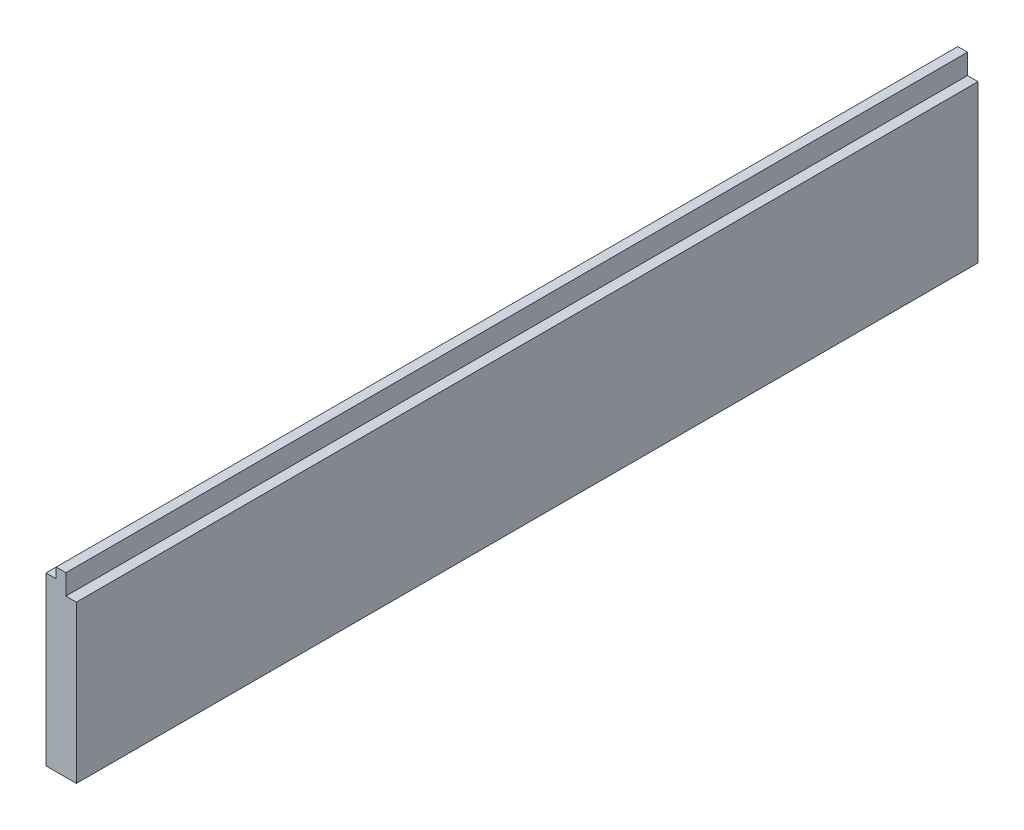
ISO-10303-21;
HEADER;
FILE_DESCRIPTION(('STEP AP214'),'2;1');
FILE_NAME('part.step','',(''),(''),'','','');
FILE_SCHEMA(('AUTOMOTIVE_DESIGN { 1 0 10303 214 1 1 1 1 }'));
ENDSEC;
DATA;
#1=APPLICATION_CONTEXT('core data for automotive mechanical design processes');
#2=APPLICATION_PROTOCOL_DEFINITION('international standard','automotive_design',2000,#1);
#3=PRODUCT_CONTEXT('',#1,'mechanical');
#4=PRODUCT('Part','Part','',(#3));
#5=PRODUCT_RELATED_PRODUCT_CATEGORY('part','',(#4));
#6=PRODUCT_DEFINITION_FORMATION('','',#4);
#7=PRODUCT_DEFINITION_CONTEXT('part definition',#1,'design');
#8=PRODUCT_DEFINITION('design','',#6,#7);
#9=PRODUCT_DEFINITION_SHAPE('','',#8);
#10=(LENGTH_UNIT() NAMED_UNIT(*) SI_UNIT(.MILLI.,.METRE.));
#11=(NAMED_UNIT(*) PLANE_ANGLE_UNIT() SI_UNIT($,.RADIAN.));
#12=(NAMED_UNIT(*) SI_UNIT($,.STERADIAN.) SOLID_ANGLE_UNIT());
#13=UNCERTAINTY_MEASURE_WITH_UNIT(LENGTH_MEASURE(1.E-05),#10,'distance_accuracy_value','');
#14=(GEOMETRIC_REPRESENTATION_CONTEXT(3) GLOBAL_UNCERTAINTY_ASSIGNED_CONTEXT((#13)) GLOBAL_UNIT_ASSIGNED_CONTEXT((#10,
#11,#12)) REPRESENTATION_CONTEXT('',''));
#15=CARTESIAN_POINT('',(0.,0.,0.));
#16=DIRECTION('',(0.,0.,1.));
#17=DIRECTION('',(1.,0.,0.));
#18=AXIS2_PLACEMENT_3D('',#15,#16,#17);
#19=CARTESIAN_POINT('',(0.,165.,890.));
#20=DIRECTION('',(1.,0.,0.));
#21=DIRECTION('',(0.,1.,0.));
#22=AXIS2_PLACEMENT_3D('',#19,#20,#21);
#23=PLANE('',#22);
#24=DIRECTION('',(0.,-1.,0.));
#25=VECTOR('',#24,1.);
#26=CARTESIAN_POINT('',(0.,165.,0.));
#27=LINE('',#26,#25);
#28=CARTESIAN_POINT('',(0.,165.,0.));
#29=VERTEX_POINT('',#28);
#30=CARTESIAN_POINT('',(0.,0.,0.));
#31=VERTEX_POINT('',#30);
#32=EDGE_CURVE('E131',#29,#31,#27,.T.);
#33=ORIENTED_EDGE('',*,*,#32,.T.);
#34=DIRECTION('',(0.,0.,-1.));
#35=VECTOR('',#34,1.);
#36=CARTESIAN_POINT('',(0.,0.,890.));
#37=LINE('',#36,#35);
#38=CARTESIAN_POINT('',(0.,0.,890.));
#39=VERTEX_POINT('',#38);
#40=EDGE_CURVE('E11',#39,#31,#37,.T.);
#41=ORIENTED_EDGE('',*,*,#40,.F.);
#42=DIRECTION('',(0.,-1.,0.));
#43=VECTOR('',#42,1.);
#44=CARTESIAN_POINT('',(0.,165.,890.));
#45=LINE('',#44,#43);
#46=CARTESIAN_POINT('',(0.,165.,890.));
#47=VERTEX_POINT('',#46);
#48=EDGE_CURVE('E145',#47,#39,#45,.T.);
#49=ORIENTED_EDGE('',*,*,#48,.F.);
#50=DIRECTION('',(0.,0.,-1.));
#51=VECTOR('',#50,1.);
#52=CARTESIAN_POINT('',(0.,165.,890.));
#53=LINE('',#52,#51);
#54=EDGE_CURVE('E127',#47,#29,#53,.T.);
#55=ORIENTED_EDGE('',*,*,#54,.T.);
#56=EDGE_LOOP('',(#33,#41,#49,#55));
#57=FACE_BOUND('',#56,.T.);
#58=ADVANCED_FACE('F35',(#57),#23,.F.);
#59=CARTESIAN_POINT('',(0.,0.,890.));
#60=DIRECTION('',(0.,1.,0.));
#61=DIRECTION('',(0.,0.,1.));
#62=AXIS2_PLACEMENT_3D('',#59,#60,#61);
#63=PLANE('',#62);
#64=DIRECTION('',(1.,0.,0.));
#65=VECTOR('',#64,1.);
#66=CARTESIAN_POINT('',(0.,0.,0.));
#67=LINE('',#66,#65);
#68=CARTESIAN_POINT('',(30.,0.,0.));
#69=VERTEX_POINT('',#68);
#70=EDGE_CURVE('E134',#31,#69,#67,.T.);
#71=ORIENTED_EDGE('',*,*,#70,.T.);
#72=DIRECTION('',(0.,0.,-1.));
#73=VECTOR('',#72,1.);
#74=CARTESIAN_POINT('',(30.,0.,890.));
#75=LINE('',#74,#73);
#76=CARTESIAN_POINT('',(30.,0.,890.));
#77=VERTEX_POINT('',#76);
#78=EDGE_CURVE('E43',#77,#69,#75,.T.);
#79=ORIENTED_EDGE('',*,*,#78,.F.);
#80=DIRECTION('',(1.,0.,0.));
#81=VECTOR('',#80,1.);
#82=CARTESIAN_POINT('',(0.,0.,890.));
#83=LINE('',#82,#81);
#84=EDGE_CURVE('E94',#39,#77,#83,.T.);
#85=ORIENTED_EDGE('',*,*,#84,.F.);
#86=ORIENTED_EDGE('',*,*,#40,.T.);
#87=EDGE_LOOP('',(#71,#79,#85,#86));
#88=FACE_BOUND('',#87,.T.);
#89=ADVANCED_FACE('F180',(#88),#63,.F.);
#90=CARTESIAN_POINT('',(30.,0.,890.));
#91=DIRECTION('',(-1.,0.,0.));
#92=DIRECTION('',(0.,-1.,0.));
#93=AXIS2_PLACEMENT_3D('',#90,#91,#92);
#94=PLANE('',#93);
#95=DIRECTION('',(0.,1.,0.));
#96=VECTOR('',#95,1.);
#97=CARTESIAN_POINT('',(30.,0.,0.));
#98=LINE('',#97,#96);
#99=CARTESIAN_POINT('',(30.,155.,0.));
#100=VERTEX_POINT('',#99);
#101=EDGE_CURVE('E136',#69,#100,#98,.T.);
#102=ORIENTED_EDGE('',*,*,#101,.T.);
#103=DIRECTION('',(0.,0.,-1.));
#104=VECTOR('',#103,1.);
#105=CARTESIAN_POINT('',(30.,155.,890.));
#106=LINE('',#105,#104);
#107=CARTESIAN_POINT('',(30.,155.,890.));
#108=VERTEX_POINT('',#107);
#109=EDGE_CURVE('E152',#108,#100,#106,.T.);
#110=ORIENTED_EDGE('',*,*,#109,.F.);
#111=DIRECTION('',(0.,1.,0.));
#112=VECTOR('',#111,1.);
#113=CARTESIAN_POINT('',(30.,0.,890.));
#114=LINE('',#113,#112);
#115=EDGE_CURVE('E160',#77,#108,#114,.T.);
#116=ORIENTED_EDGE('',*,*,#115,.F.);
#117=ORIENTED_EDGE('',*,*,#78,.T.);
#118=EDGE_LOOP('',(#102,#110,#116,#117));
#119=FACE_BOUND('',#118,.T.);
#120=ADVANCED_FACE('F158',(#119),#94,.F.);
#121=CARTESIAN_POINT('',(30.,155.,890.));
#122=DIRECTION('',(0.,-1.,0.));
#123=DIRECTION('',(0.,0.,-1.));
#124=AXIS2_PLACEMENT_3D('',#121,#122,#123);
#125=PLANE('',#124);
#126=DIRECTION('',(-1.,0.,0.));
#127=VECTOR('',#126,1.);
#128=CARTESIAN_POINT('',(30.,155.,0.));
#129=LINE('',#128,#127);
#130=CARTESIAN_POINT('',(19.6619478750926,155.,0.));
#131=VERTEX_POINT('',#130);
#132=EDGE_CURVE('E138',#100,#131,#129,.T.);
#133=ORIENTED_EDGE('',*,*,#132,.T.);
#134=DIRECTION('',(0.,0.,-1.));
#135=VECTOR('',#134,1.);
#136=CARTESIAN_POINT('',(19.6619478750926,155.,890.));
#137=LINE('',#136,#135);
#138=CARTESIAN_POINT('',(19.6619478750926,155.,890.));
#139=VERTEX_POINT('',#138);
#140=EDGE_CURVE('E149',#139,#131,#137,.T.);
#141=ORIENTED_EDGE('',*,*,#140,.F.);
#142=DIRECTION('',(-1.,0.,0.));
#143=VECTOR('',#142,1.);
#144=CARTESIAN_POINT('',(30.,155.,890.));
#145=LINE('',#144,#143);
#146=EDGE_CURVE('E172',#108,#139,#145,.T.);
#147=ORIENTED_EDGE('',*,*,#146,.F.);
#148=ORIENTED_EDGE('',*,*,#109,.T.);
#149=EDGE_LOOP('',(#133,#141,#147,#148));
#150=FACE_BOUND('',#149,.T.);
#151=ADVANCED_FACE('F168',(#150),#125,.F.);
#152=CARTESIAN_POINT('',(19.6619478750926,155.,890.));
#153=DIRECTION('',(-1.,0.,0.));
#154=DIRECTION('',(0.,-1.,0.));
#155=AXIS2_PLACEMENT_3D('',#152,#153,#154);
#156=PLANE('',#155);
#157=DIRECTION('',(0.,1.,0.));
#158=VECTOR('',#157,1.);
#159=CARTESIAN_POINT('',(19.6619478750926,155.,0.));
#160=LINE('',#159,#158);
#161=CARTESIAN_POINT('',(19.6619478750926,175.,0.));
#162=VERTEX_POINT('',#161);
#163=EDGE_CURVE('E140',#131,#162,#160,.T.);
#164=ORIENTED_EDGE('',*,*,#163,.T.);
#165=DIRECTION('',(0.,0.,-1.));
#166=VECTOR('',#165,1.);
#167=CARTESIAN_POINT('',(19.6619478750926,175.,890.));
#168=LINE('',#167,#166);
#169=CARTESIAN_POINT('',(19.6619478750926,175.,890.));
#170=VERTEX_POINT('',#169);
#171=EDGE_CURVE('E122',#170,#162,#168,.T.);
#172=ORIENTED_EDGE('',*,*,#171,.F.);
#173=DIRECTION('',(0.,1.,0.));
#174=VECTOR('',#173,1.);
#175=CARTESIAN_POINT('',(19.6619478750926,155.,890.));
#176=LINE('',#175,#174);
#177=EDGE_CURVE('E113',#139,#170,#176,.T.);
#178=ORIENTED_EDGE('',*,*,#177,.F.);
#179=ORIENTED_EDGE('',*,*,#140,.T.);
#180=EDGE_LOOP('',(#164,#172,#178,#179));
#181=FACE_BOUND('',#180,.T.);
#182=ADVANCED_FACE('F171',(#181),#156,.F.);
#183=CARTESIAN_POINT('',(19.6619478750926,175.,890.));
#184=DIRECTION('',(0.,-1.,0.));
#185=DIRECTION('',(0.,0.,-1.));
#186=AXIS2_PLACEMENT_3D('',#183,#184,#185);
#187=PLANE('',#186);
#188=DIRECTION('',(-1.,0.,0.));
#189=VECTOR('',#188,1.);
#190=CARTESIAN_POINT('',(19.6619478750926,175.,0.));
#191=LINE('',#190,#189);
#192=CARTESIAN_POINT('',(10.,175.,0.));
#193=VERTEX_POINT('',#192);
#194=EDGE_CURVE('E121',#162,#193,#191,.T.);
#195=ORIENTED_EDGE('',*,*,#194,.T.);
#196=DIRECTION('',(0.,0.,-1.));
#197=VECTOR('',#196,1.);
#198=CARTESIAN_POINT('',(10.,175.,890.));
#199=LINE('',#198,#197);
#200=CARTESIAN_POINT('',(10.,175.,890.));
#201=VERTEX_POINT('',#200);
#202=EDGE_CURVE('E118',#201,#193,#199,.T.);
#203=ORIENTED_EDGE('',*,*,#202,.F.);
#204=DIRECTION('',(-1.,0.,0.));
#205=VECTOR('',#204,1.);
#206=CARTESIAN_POINT('',(19.6619478750926,175.,890.));
#207=LINE('',#206,#205);
#208=EDGE_CURVE('E107',#170,#201,#207,.T.);
#209=ORIENTED_EDGE('',*,*,#208,.F.);
#210=ORIENTED_EDGE('',*,*,#171,.T.);
#211=EDGE_LOOP('',(#195,#203,#209,#210));
#212=FACE_BOUND('',#211,.T.);
#213=ADVANCED_FACE('F119',(#212),#187,.F.);
#214=CARTESIAN_POINT('',(10.,175.,890.));
#215=DIRECTION('',(1.,0.,0.));
#216=DIRECTION('',(0.,1.,0.));
#217=AXIS2_PLACEMENT_3D('',#214,#215,#216);
#218=PLANE('',#217);
#219=DIRECTION('',(0.,-1.,0.));
#220=VECTOR('',#219,1.);
#221=CARTESIAN_POINT('',(10.,175.,0.));
#222=LINE('',#221,#220);
#223=CARTESIAN_POINT('',(10.,165.,0.));
#224=VERTEX_POINT('',#223);
#225=EDGE_CURVE('E80',#193,#224,#222,.T.);
#226=ORIENTED_EDGE('',*,*,#225,.T.);
#227=DIRECTION('',(0.,0.,-1.));
#228=VECTOR('',#227,1.);
#229=CARTESIAN_POINT('',(10.,165.,890.));
#230=LINE('',#229,#228);
#231=CARTESIAN_POINT('',(10.,165.,890.));
#232=VERTEX_POINT('',#231);
#233=EDGE_CURVE('E123',#232,#224,#230,.T.);
#234=ORIENTED_EDGE('',*,*,#233,.F.);
#235=DIRECTION('',(0.,-1.,0.));
#236=VECTOR('',#235,1.);
#237=CARTESIAN_POINT('',(10.,175.,890.));
#238=LINE('',#237,#236);
#239=EDGE_CURVE('E111',#201,#232,#238,.T.);
#240=ORIENTED_EDGE('',*,*,#239,.F.);
#241=ORIENTED_EDGE('',*,*,#202,.T.);
#242=EDGE_LOOP('',(#226,#234,#240,#241));
#243=FACE_BOUND('',#242,.T.);
#244=ADVANCED_FACE('F125',(#243),#218,.F.);
#245=CARTESIAN_POINT('',(10.,165.,890.));
#246=DIRECTION('',(0.,-1.,0.));
#247=DIRECTION('',(0.,0.,-1.));
#248=AXIS2_PLACEMENT_3D('',#245,#246,#247);
#249=PLANE('',#248);
#250=DIRECTION('',(-1.,0.,0.));
#251=VECTOR('',#250,1.);
#252=CARTESIAN_POINT('',(10.,165.,0.));
#253=LINE('',#252,#251);
#254=EDGE_CURVE('E86',#224,#29,#253,.T.);
#255=ORIENTED_EDGE('',*,*,#254,.T.);
#256=ORIENTED_EDGE('',*,*,#54,.F.);
#257=DIRECTION('',(-1.,0.,0.));
#258=VECTOR('',#257,1.);
#259=CARTESIAN_POINT('',(10.,165.,890.));
#260=LINE('',#259,#258);
#261=EDGE_CURVE('E51',#232,#47,#260,.T.);
#262=ORIENTED_EDGE('',*,*,#261,.F.);
#263=ORIENTED_EDGE('',*,*,#233,.T.);
#264=EDGE_LOOP('',(#255,#256,#262,#263));
#265=FACE_BOUND('',#264,.T.);
#266=ADVANCED_FACE('F196',(#265),#249,.F.);
#267=CARTESIAN_POINT('',(0.,0.,890.));
#268=DIRECTION('',(0.,0.,1.));
#269=DIRECTION('',(1.,0.,0.));
#270=AXIS2_PLACEMENT_3D('',#267,#268,#269);
#271=PLANE('',#270);
#272=ORIENTED_EDGE('',*,*,#48,.T.);
#273=ORIENTED_EDGE('',*,*,#84,.T.);
#274=ORIENTED_EDGE('',*,*,#115,.T.);
#275=ORIENTED_EDGE('',*,*,#146,.T.);
#276=ORIENTED_EDGE('',*,*,#177,.T.);
#277=ORIENTED_EDGE('',*,*,#208,.T.);
#278=ORIENTED_EDGE('',*,*,#239,.T.);
#279=ORIENTED_EDGE('',*,*,#261,.T.);
#280=EDGE_LOOP('',(#272,#273,#274,#275,#276,#277,#278,#279));
#281=FACE_BOUND('',#280,.T.);
#282=ADVANCED_FACE('F109',(#281),#271,.T.);
#283=CARTESIAN_POINT('',(0.,0.,0.));
#284=DIRECTION('',(0.,0.,1.));
#285=DIRECTION('',(1.,0.,0.));
#286=AXIS2_PLACEMENT_3D('',#283,#284,#285);
#287=PLANE('',#286);
#288=ORIENTED_EDGE('',*,*,#32,.F.);
#289=ORIENTED_EDGE('',*,*,#254,.F.);
#290=ORIENTED_EDGE('',*,*,#225,.F.);
#291=ORIENTED_EDGE('',*,*,#194,.F.);
#292=ORIENTED_EDGE('',*,*,#163,.F.);
#293=ORIENTED_EDGE('',*,*,#132,.F.);
#294=ORIENTED_EDGE('',*,*,#101,.F.);
#295=ORIENTED_EDGE('',*,*,#70,.F.);
#296=EDGE_LOOP('',(#288,#289,#290,#291,#292,#293,#294,#295));
#297=FACE_BOUND('',#296,.T.);
#298=ADVANCED_FACE('F164',(#297),#287,.F.);
#299=CLOSED_SHELL('',(#58,#89,#120,#151,#182,#213,#244,#266,#282,#298));
#300=MANIFOLD_SOLID_BREP('B2',#299);
#301=ADVANCED_BREP_SHAPE_REPRESENTATION('',(#18,#300),#14);
#302=SHAPE_DEFINITION_REPRESENTATION(#9,#301);
ENDSEC;
END-ISO-10303-21;
